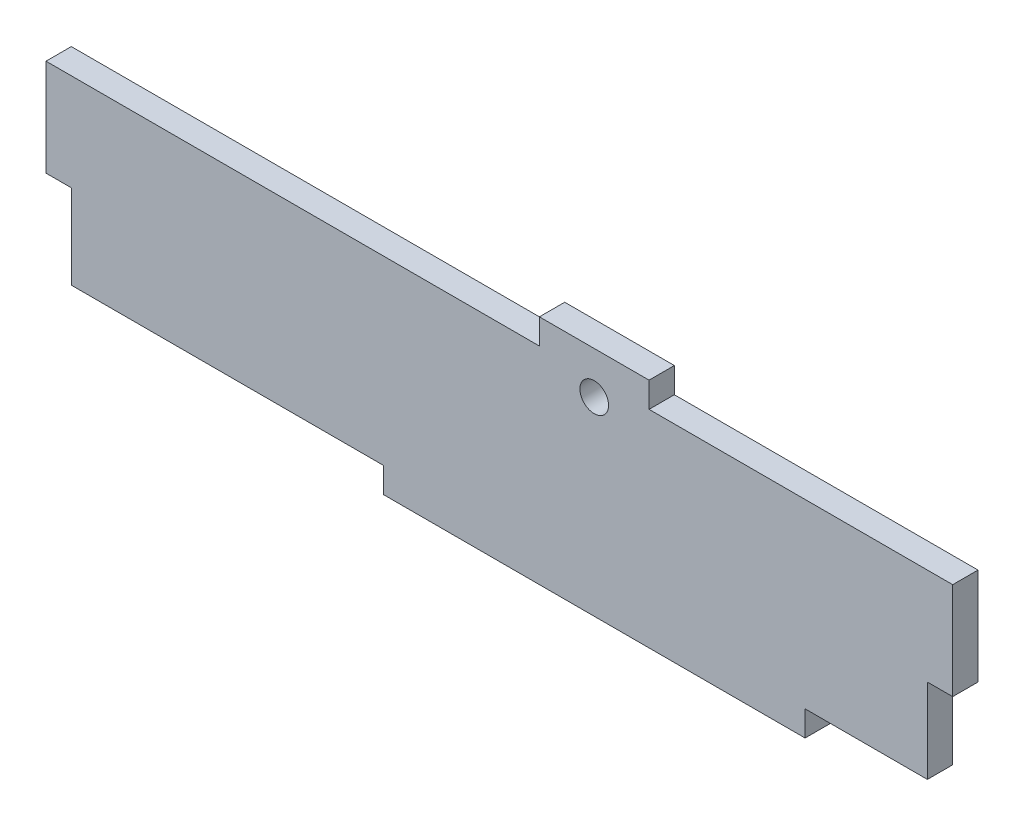
ISO-10303-21;
HEADER;
FILE_DESCRIPTION(('STEP AP214'),'2;1');
FILE_NAME('part.step','',(''),(''),'','','');
FILE_SCHEMA(('AUTOMOTIVE_DESIGN { 1 0 10303 214 1 1 1 1 }'));
ENDSEC;
DATA;
#1=APPLICATION_CONTEXT('core data for automotive mechanical design processes');
#2=APPLICATION_PROTOCOL_DEFINITION('international standard','automotive_design',2000,#1);
#3=PRODUCT_CONTEXT('',#1,'mechanical');
#4=PRODUCT('Part','Part','',(#3));
#5=PRODUCT_RELATED_PRODUCT_CATEGORY('part','',(#4));
#6=PRODUCT_DEFINITION_FORMATION('','',#4);
#7=PRODUCT_DEFINITION_CONTEXT('part definition',#1,'design');
#8=PRODUCT_DEFINITION('design','',#6,#7);
#9=PRODUCT_DEFINITION_SHAPE('','',#8);
#10=(LENGTH_UNIT() NAMED_UNIT(*) SI_UNIT(.MILLI.,.METRE.));
#11=(NAMED_UNIT(*) PLANE_ANGLE_UNIT() SI_UNIT($,.RADIAN.));
#12=(NAMED_UNIT(*) SI_UNIT($,.STERADIAN.) SOLID_ANGLE_UNIT());
#13=UNCERTAINTY_MEASURE_WITH_UNIT(LENGTH_MEASURE(1.E-05),#10,'distance_accuracy_value','');
#14=(GEOMETRIC_REPRESENTATION_CONTEXT(3) GLOBAL_UNCERTAINTY_ASSIGNED_CONTEXT((#13)) GLOBAL_UNIT_ASSIGNED_CONTEXT((#10,
#11,#12)) REPRESENTATION_CONTEXT('',''));
#15=CARTESIAN_POINT('',(0.,0.,0.));
#16=DIRECTION('',(0.,0.,1.));
#17=DIRECTION('',(1.,0.,0.));
#18=AXIS2_PLACEMENT_3D('',#15,#16,#17);
#19=CARTESIAN_POINT('',(-130.,0.,6.));
#20=DIRECTION('',(0.,1.,0.));
#21=DIRECTION('',(0.,0.,1.));
#22=AXIS2_PLACEMENT_3D('',#19,#20,#21);
#23=PLANE('',#22);
#24=DIRECTION('',(0.,0.,-1.));
#25=VECTOR('',#24,1.);
#26=CARTESIAN_POINT('',(-50.,0.,6.));
#27=LINE('',#26,#25);
#28=CARTESIAN_POINT('',(-50.,0.,6.));
#29=VERTEX_POINT('',#28);
#30=CARTESIAN_POINT('',(-50.,0.,0.));
#31=VERTEX_POINT('',#30);
#32=EDGE_CURVE('E180',#29,#31,#27,.T.);
#33=ORIENTED_EDGE('',*,*,#32,.F.);
#34=DIRECTION('',(1.,0.,0.));
#35=VECTOR('',#34,1.);
#36=CARTESIAN_POINT('',(-130.,0.,6.));
#37=LINE('',#36,#35);
#38=CARTESIAN_POINT('',(-124.,0.,6.));
#39=VERTEX_POINT('',#38);
#40=EDGE_CURVE('E263',#39,#29,#37,.T.);
#41=ORIENTED_EDGE('',*,*,#40,.F.);
#42=DIRECTION('',(0.,0.,-1.));
#43=VECTOR('',#42,1.);
#44=CARTESIAN_POINT('',(-124.,0.,6.001));
#45=LINE('',#44,#43);
#46=CARTESIAN_POINT('',(-124.,0.,0.));
#47=VERTEX_POINT('',#46);
#48=EDGE_CURVE('E210',#39,#47,#45,.T.);
#49=ORIENTED_EDGE('',*,*,#48,.T.);
#50=DIRECTION('',(1.,0.,0.));
#51=VECTOR('',#50,1.);
#52=CARTESIAN_POINT('',(-130.,0.,0.));
#53=LINE('',#52,#51);
#54=EDGE_CURVE('E269',#47,#31,#53,.T.);
#55=ORIENTED_EDGE('',*,*,#54,.T.);
#56=EDGE_LOOP('',(#33,#41,#49,#55));
#57=FACE_BOUND('',#56,.T.);
#58=ADVANCED_FACE('F33',(#57),#23,.F.);
#59=CARTESIAN_POINT('',(-130.,0.,6.));
#60=DIRECTION('',(1.,0.,0.));
#61=DIRECTION('',(0.,0.,-1.));
#62=AXIS2_PLACEMENT_3D('',#59,#60,#61);
#63=PLANE('',#62);
#64=DIRECTION('',(0.,-1.,0.));
#65=VECTOR('',#64,1.);
#66=CARTESIAN_POINT('',(-130.,0.,0.));
#67=LINE('',#66,#65);
#68=CARTESIAN_POINT('',(-130.,43.,0.));
#69=VERTEX_POINT('',#68);
#70=CARTESIAN_POINT('',(-130.,20.,0.));
#71=VERTEX_POINT('',#70);
#72=EDGE_CURVE('E243',#69,#71,#67,.T.);
#73=ORIENTED_EDGE('',*,*,#72,.T.);
#74=DIRECTION('',(0.,0.,-1.));
#75=VECTOR('',#74,1.);
#76=CARTESIAN_POINT('',(-130.,20.,6.001));
#77=LINE('',#76,#75);
#78=CARTESIAN_POINT('',(-130.,20.,6.));
#79=VERTEX_POINT('',#78);
#80=EDGE_CURVE('E58',#79,#71,#77,.T.);
#81=ORIENTED_EDGE('',*,*,#80,.F.);
#82=DIRECTION('',(0.,-1.,0.));
#83=VECTOR('',#82,1.);
#84=CARTESIAN_POINT('',(-130.,0.,6.));
#85=LINE('',#84,#83);
#86=CARTESIAN_POINT('',(-130.,43.,6.));
#87=VERTEX_POINT('',#86);
#88=EDGE_CURVE('E259',#87,#79,#85,.T.);
#89=ORIENTED_EDGE('',*,*,#88,.F.);
#90=DIRECTION('',(0.,0.,-1.));
#91=VECTOR('',#90,1.);
#92=CARTESIAN_POINT('',(-130.,43.,6.001));
#93=LINE('',#92,#91);
#94=EDGE_CURVE('E252',#87,#69,#93,.T.);
#95=ORIENTED_EDGE('',*,*,#94,.T.);
#96=EDGE_LOOP('',(#73,#81,#89,#95));
#97=FACE_BOUND('',#96,.T.);
#98=ADVANCED_FACE('F35',(#97),#63,.F.);
#99=CARTESIAN_POINT('',(50.,0.,6.));
#100=VERTEX_POINT('',#99);
#101=CARTESIAN_POINT('',(79.,0.,6.));
#102=VERTEX_POINT('',#101);
#103=EDGE_CURVE('E262',#100,#102,#37,.T.);
#104=ORIENTED_EDGE('',*,*,#103,.F.);
#105=DIRECTION('',(0.,0.,-1.));
#106=VECTOR('',#105,1.);
#107=CARTESIAN_POINT('',(50.,0.,6.));
#108=LINE('',#107,#106);
#109=CARTESIAN_POINT('',(50.,0.,0.));
#110=VERTEX_POINT('',#109);
#111=EDGE_CURVE('E169',#100,#110,#108,.T.);
#112=ORIENTED_EDGE('',*,*,#111,.T.);
#113=CARTESIAN_POINT('',(79.,0.,0.));
#114=VERTEX_POINT('',#113);
#115=EDGE_CURVE('E268',#110,#114,#53,.T.);
#116=ORIENTED_EDGE('',*,*,#115,.T.);
#117=DIRECTION('',(0.,0.,-1.));
#118=VECTOR('',#117,1.);
#119=CARTESIAN_POINT('',(79.,0.,6.001));
#120=LINE('',#119,#118);
#121=EDGE_CURVE('E195',#102,#114,#120,.T.);
#122=ORIENTED_EDGE('',*,*,#121,.F.);
#123=EDGE_LOOP('',(#104,#112,#116,#122));
#124=FACE_BOUND('',#123,.T.);
#125=ADVANCED_FACE('F314',(#124),#23,.F.);
#126=CARTESIAN_POINT('',(85.,0.,6.));
#127=DIRECTION('',(-1.,0.,0.));
#128=DIRECTION('',(0.,0.,1.));
#129=AXIS2_PLACEMENT_3D('',#126,#127,#128);
#130=PLANE('',#129);
#131=DIRECTION('',(0.,1.,0.));
#132=VECTOR('',#131,1.);
#133=CARTESIAN_POINT('',(85.,0.,6.));
#134=LINE('',#133,#132);
#135=CARTESIAN_POINT('',(85.,20.,6.));
#136=VERTEX_POINT('',#135);
#137=CARTESIAN_POINT('',(85.,43.,6.));
#138=VERTEX_POINT('',#137);
#139=EDGE_CURVE('E42',#136,#138,#134,.T.);
#140=ORIENTED_EDGE('',*,*,#139,.F.);
#141=DIRECTION('',(0.,0.,-1.));
#142=VECTOR('',#141,1.);
#143=CARTESIAN_POINT('',(85.,20.,6.001));
#144=LINE('',#143,#142);
#145=CARTESIAN_POINT('',(85.,20.,0.));
#146=VERTEX_POINT('',#145);
#147=EDGE_CURVE('E196',#136,#146,#144,.T.);
#148=ORIENTED_EDGE('',*,*,#147,.T.);
#149=DIRECTION('',(0.,1.,0.));
#150=VECTOR('',#149,1.);
#151=CARTESIAN_POINT('',(85.,0.,0.));
#152=LINE('',#151,#150);
#153=CARTESIAN_POINT('',(85.,43.,0.));
#154=VERTEX_POINT('',#153);
#155=EDGE_CURVE('E271',#146,#154,#152,.T.);
#156=ORIENTED_EDGE('',*,*,#155,.T.);
#157=DIRECTION('',(0.,0.,-1.));
#158=VECTOR('',#157,1.);
#159=CARTESIAN_POINT('',(85.,43.,6.001));
#160=LINE('',#159,#158);
#161=EDGE_CURVE('E232',#138,#154,#160,.T.);
#162=ORIENTED_EDGE('',*,*,#161,.F.);
#163=EDGE_LOOP('',(#140,#148,#156,#162));
#164=FACE_BOUND('',#163,.T.);
#165=ADVANCED_FACE('F309',(#164),#130,.F.);
#166=CARTESIAN_POINT('',(-130.,48.9999999999999,6.));
#167=DIRECTION('',(0.,-1.,0.));
#168=DIRECTION('',(0.,0.,-1.));
#169=AXIS2_PLACEMENT_3D('',#166,#167,#168);
#170=PLANE('',#169);
#171=DIRECTION('',(-1.,0.,0.));
#172=VECTOR('',#171,1.);
#173=CARTESIAN_POINT('',(-130.,48.9999999999999,6.));
#174=LINE('',#173,#172);
#175=CARTESIAN_POINT('',(13.,48.9999999999999,6.));
#176=VERTEX_POINT('',#175);
#177=CARTESIAN_POINT('',(-13.,48.9999999999999,6.));
#178=VERTEX_POINT('',#177);
#179=EDGE_CURVE('E11',#176,#178,#174,.T.);
#180=ORIENTED_EDGE('',*,*,#179,.F.);
#181=DIRECTION('',(0.,0.,-1.));
#182=VECTOR('',#181,1.);
#183=CARTESIAN_POINT('',(13.,48.9999999999999,6.001));
#184=LINE('',#183,#182);
#185=CARTESIAN_POINT('',(13.,48.9999999999999,0.));
#186=VERTEX_POINT('',#185);
#187=EDGE_CURVE('E233',#176,#186,#184,.T.);
#188=ORIENTED_EDGE('',*,*,#187,.T.);
#189=DIRECTION('',(-1.,0.,0.));
#190=VECTOR('',#189,1.);
#191=CARTESIAN_POINT('',(-130.,48.9999999999999,0.));
#192=LINE('',#191,#190);
#193=CARTESIAN_POINT('',(-13.,48.9999999999999,0.));
#194=VERTEX_POINT('',#193);
#195=EDGE_CURVE('E37',#186,#194,#192,.T.);
#196=ORIENTED_EDGE('',*,*,#195,.T.);
#197=DIRECTION('',(0.,0.,-1.));
#198=VECTOR('',#197,1.);
#199=CARTESIAN_POINT('',(-13.,48.9999999999999,6.001));
#200=LINE('',#199,#198);
#201=EDGE_CURVE('E250',#178,#194,#200,.T.);
#202=ORIENTED_EDGE('',*,*,#201,.F.);
#203=EDGE_LOOP('',(#180,#188,#196,#202));
#204=FACE_BOUND('',#203,.T.);
#205=ADVANCED_FACE('F280',(#204),#170,.F.);
#206=CARTESIAN_POINT('',(0.,0.,6.));
#207=DIRECTION('',(0.,0.,-1.));
#208=DIRECTION('',(-1.,0.,0.));
#209=AXIS2_PLACEMENT_3D('',#206,#207,#208);
#210=PLANE('',#209);
#211=CARTESIAN_POINT('',(0.,39.,6.));
#212=DIRECTION('',(0.,0.,-1.));
#213=DIRECTION('',(-1.,0.,0.));
#214=AXIS2_PLACEMENT_3D('',#211,#212,#213);
#215=CIRCLE('',#214,3.4);
#216=CARTESIAN_POINT('',(-3.39999999999999,39.,6.));
#217=VERTEX_POINT('',#216);
#218=EDGE_CURVE('E219',#217,#217,#215,.T.);
#219=ORIENTED_EDGE('',*,*,#218,.T.);
#220=EDGE_LOOP('',(#219));
#221=FACE_BOUND('',#220,.T.);
#222=DIRECTION('',(0.,-1.,0.));
#223=VECTOR('',#222,1.);
#224=CARTESIAN_POINT('',(79.,0.,6.));
#225=LINE('',#224,#223);
#226=CARTESIAN_POINT('',(79.,20.,6.));
#227=VERTEX_POINT('',#226);
#228=EDGE_CURVE('E183',#227,#102,#225,.T.);
#229=ORIENTED_EDGE('',*,*,#228,.F.);
#230=DIRECTION('',(-1.,0.,0.));
#231=VECTOR('',#230,1.);
#232=CARTESIAN_POINT('',(85.,20.,6.));
#233=LINE('',#232,#231);
#234=EDGE_CURVE('E186',#136,#227,#233,.T.);
#235=ORIENTED_EDGE('',*,*,#234,.F.);
#236=ORIENTED_EDGE('',*,*,#139,.T.);
#237=DIRECTION('',(1.,0.,0.));
#238=VECTOR('',#237,1.);
#239=CARTESIAN_POINT('',(85.,43.,6.));
#240=LINE('',#239,#238);
#241=CARTESIAN_POINT('',(13.,43.,6.));
#242=VERTEX_POINT('',#241);
#243=EDGE_CURVE('E236',#242,#138,#240,.T.);
#244=ORIENTED_EDGE('',*,*,#243,.F.);
#245=DIRECTION('',(0.,-1.,0.));
#246=VECTOR('',#245,1.);
#247=CARTESIAN_POINT('',(13.,48.9999999999999,6.));
#248=LINE('',#247,#246);
#249=EDGE_CURVE('E223',#176,#242,#248,.T.);
#250=ORIENTED_EDGE('',*,*,#249,.F.);
#251=ORIENTED_EDGE('',*,*,#179,.T.);
#252=DIRECTION('',(0.,1.,0.));
#253=VECTOR('',#252,1.);
#254=CARTESIAN_POINT('',(-13.,48.9999999999999,6.));
#255=LINE('',#254,#253);
#256=CARTESIAN_POINT('',(-13.,43.,6.));
#257=VERTEX_POINT('',#256);
#258=EDGE_CURVE('E222',#257,#178,#255,.T.);
#259=ORIENTED_EDGE('',*,*,#258,.F.);
#260=DIRECTION('',(1.,0.,0.));
#261=VECTOR('',#260,1.);
#262=CARTESIAN_POINT('',(-13.,43.,6.));
#263=LINE('',#262,#261);
#264=EDGE_CURVE('E227',#87,#257,#263,.T.);
#265=ORIENTED_EDGE('',*,*,#264,.F.);
#266=ORIENTED_EDGE('',*,*,#88,.T.);
#267=DIRECTION('',(-1.,0.,0.));
#268=VECTOR('',#267,1.);
#269=CARTESIAN_POINT('',(-130.,20.,6.));
#270=LINE('',#269,#268);
#271=CARTESIAN_POINT('',(-124.,20.,6.));
#272=VERTEX_POINT('',#271);
#273=EDGE_CURVE('E187',#272,#79,#270,.T.);
#274=ORIENTED_EDGE('',*,*,#273,.F.);
#275=DIRECTION('',(0.,1.,0.));
#276=VECTOR('',#275,1.);
#277=CARTESIAN_POINT('',(-124.,0.,6.));
#278=LINE('',#277,#276);
#279=EDGE_CURVE('E179',#39,#272,#278,.T.);
#280=ORIENTED_EDGE('',*,*,#279,.F.);
#281=ORIENTED_EDGE('',*,*,#40,.T.);
#282=DIRECTION('',(0.,1.,0.));
#283=VECTOR('',#282,1.);
#284=CARTESIAN_POINT('',(-50.,0.,6.));
#285=LINE('',#284,#283);
#286=CARTESIAN_POINT('',(-50.,-5.99999999999998,6.));
#287=VERTEX_POINT('',#286);
#288=EDGE_CURVE('E157',#287,#29,#285,.T.);
#289=ORIENTED_EDGE('',*,*,#288,.F.);
#290=DIRECTION('',(-1.,0.,0.));
#291=VECTOR('',#290,1.);
#292=CARTESIAN_POINT('',(50.,-6.,6.));
#293=LINE('',#292,#291);
#294=CARTESIAN_POINT('',(50.,-6.,6.));
#295=VERTEX_POINT('',#294);
#296=EDGE_CURVE('E152',#295,#287,#293,.T.);
#297=ORIENTED_EDGE('',*,*,#296,.F.);
#298=DIRECTION('',(0.,-1.,0.));
#299=VECTOR('',#298,1.);
#300=CARTESIAN_POINT('',(50.,0.,6.));
#301=LINE('',#300,#299);
#302=EDGE_CURVE('E164',#100,#295,#301,.T.);
#303=ORIENTED_EDGE('',*,*,#302,.F.);
#304=ORIENTED_EDGE('',*,*,#103,.T.);
#305=EDGE_LOOP('',(#229,#235,#236,#244,#250,#251,#259,#265,#266,#274,#280,#281,#289,#297,#303,#304));
#306=FACE_BOUND('',#305,.T.);
#307=ADVANCED_FACE('F163',(#221,#306),#210,.F.);
#308=CARTESIAN_POINT('',(0.,0.,0.));
#309=DIRECTION('',(0.,0.,-1.));
#310=DIRECTION('',(-1.,0.,0.));
#311=AXIS2_PLACEMENT_3D('',#308,#309,#310);
#312=PLANE('',#311);
#313=DIRECTION('',(1.,0.,0.));
#314=VECTOR('',#313,1.);
#315=CARTESIAN_POINT('',(85.,20.,0.));
#316=LINE('',#315,#314);
#317=CARTESIAN_POINT('',(79.,20.,0.));
#318=VERTEX_POINT('',#317);
#319=EDGE_CURVE('E193',#318,#146,#316,.T.);
#320=ORIENTED_EDGE('',*,*,#319,.F.);
#321=DIRECTION('',(0.,1.,0.));
#322=VECTOR('',#321,1.);
#323=CARTESIAN_POINT('',(79.,0.,0.));
#324=LINE('',#323,#322);
#325=EDGE_CURVE('E190',#114,#318,#324,.T.);
#326=ORIENTED_EDGE('',*,*,#325,.F.);
#327=ORIENTED_EDGE('',*,*,#115,.F.);
#328=DIRECTION('',(0.,-1.,0.));
#329=VECTOR('',#328,1.);
#330=CARTESIAN_POINT('',(50.,0.,0.));
#331=LINE('',#330,#329);
#332=CARTESIAN_POINT('',(50.,-6.,0.));
#333=VERTEX_POINT('',#332);
#334=EDGE_CURVE('E50',#110,#333,#331,.T.);
#335=ORIENTED_EDGE('',*,*,#334,.T.);
#336=DIRECTION('',(-1.,0.,0.));
#337=VECTOR('',#336,1.);
#338=CARTESIAN_POINT('',(50.,-6.,0.));
#339=LINE('',#338,#337);
#340=CARTESIAN_POINT('',(-50.,-5.99999999999998,0.));
#341=VERTEX_POINT('',#340);
#342=EDGE_CURVE('E154',#333,#341,#339,.T.);
#343=ORIENTED_EDGE('',*,*,#342,.T.);
#344=DIRECTION('',(0.,1.,0.));
#345=VECTOR('',#344,1.);
#346=CARTESIAN_POINT('',(-50.,0.,0.));
#347=LINE('',#346,#345);
#348=EDGE_CURVE('E170',#341,#31,#347,.T.);
#349=ORIENTED_EDGE('',*,*,#348,.T.);
#350=ORIENTED_EDGE('',*,*,#54,.F.);
#351=DIRECTION('',(0.,-1.,0.));
#352=VECTOR('',#351,1.);
#353=CARTESIAN_POINT('',(-124.,0.,0.));
#354=LINE('',#353,#352);
#355=CARTESIAN_POINT('',(-124.,20.,0.));
#356=VERTEX_POINT('',#355);
#357=EDGE_CURVE('E208',#356,#47,#354,.T.);
#358=ORIENTED_EDGE('',*,*,#357,.F.);
#359=DIRECTION('',(1.,0.,0.));
#360=VECTOR('',#359,1.);
#361=CARTESIAN_POINT('',(-130.,20.,0.));
#362=LINE('',#361,#360);
#363=EDGE_CURVE('E206',#71,#356,#362,.T.);
#364=ORIENTED_EDGE('',*,*,#363,.F.);
#365=ORIENTED_EDGE('',*,*,#72,.F.);
#366=DIRECTION('',(-1.,0.,0.));
#367=VECTOR('',#366,1.);
#368=CARTESIAN_POINT('',(-13.,43.,0.));
#369=LINE('',#368,#367);
#370=CARTESIAN_POINT('',(-13.,43.,0.));
#371=VERTEX_POINT('',#370);
#372=EDGE_CURVE('E247',#371,#69,#369,.T.);
#373=ORIENTED_EDGE('',*,*,#372,.F.);
#374=DIRECTION('',(0.,-1.,0.));
#375=VECTOR('',#374,1.);
#376=CARTESIAN_POINT('',(-13.,48.9999999999999,0.));
#377=LINE('',#376,#375);
#378=EDGE_CURVE('E245',#194,#371,#377,.T.);
#379=ORIENTED_EDGE('',*,*,#378,.F.);
#380=ORIENTED_EDGE('',*,*,#195,.F.);
#381=DIRECTION('',(0.,1.,0.));
#382=VECTOR('',#381,1.);
#383=CARTESIAN_POINT('',(13.,48.9999999999999,0.));
#384=LINE('',#383,#382);
#385=CARTESIAN_POINT('',(13.,43.,0.));
#386=VERTEX_POINT('',#385);
#387=EDGE_CURVE('E230',#386,#186,#384,.T.);
#388=ORIENTED_EDGE('',*,*,#387,.F.);
#389=DIRECTION('',(-1.,0.,0.));
#390=VECTOR('',#389,1.);
#391=CARTESIAN_POINT('',(85.,43.,0.));
#392=LINE('',#391,#390);
#393=EDGE_CURVE('E226',#154,#386,#392,.T.);
#394=ORIENTED_EDGE('',*,*,#393,.F.);
#395=ORIENTED_EDGE('',*,*,#155,.F.);
#396=EDGE_LOOP('',(#320,#326,#327,#335,#343,#349,#350,#358,#364,#365,#373,#379,#380,#388,#394,#395));
#397=FACE_BOUND('',#396,.T.);
#398=CARTESIAN_POINT('',(0.,39.,0.));
#399=DIRECTION('',(0.,0.,-1.));
#400=DIRECTION('',(-1.,0.,0.));
#401=AXIS2_PLACEMENT_3D('',#398,#399,#400);
#402=CIRCLE('',#401,3.39999999999999);
#403=CARTESIAN_POINT('',(-3.39999999999999,39.,0.));
#404=VERTEX_POINT('',#403);
#405=EDGE_CURVE('E199',#404,#404,#402,.T.);
#406=ORIENTED_EDGE('',*,*,#405,.F.);
#407=EDGE_LOOP('',(#406));
#408=FACE_BOUND('',#407,.T.);
#409=ADVANCED_FACE('F285',(#397,#408),#312,.T.);
#410=CARTESIAN_POINT('',(-13.,48.9999999999999,6.001));
#411=DIRECTION('',(1.,0.,0.));
#412=DIRECTION('',(0.,0.,-1.));
#413=AXIS2_PLACEMENT_3D('',#410,#411,#412);
#414=PLANE('',#413);
#415=ORIENTED_EDGE('',*,*,#258,.T.);
#416=ORIENTED_EDGE('',*,*,#201,.T.);
#417=ORIENTED_EDGE('',*,*,#378,.T.);
#418=DIRECTION('',(0.,0.,-1.));
#419=VECTOR('',#418,1.);
#420=CARTESIAN_POINT('',(-13.,43.,6.001));
#421=LINE('',#420,#419);
#422=EDGE_CURVE('E249',#257,#371,#421,.T.);
#423=ORIENTED_EDGE('',*,*,#422,.F.);
#424=EDGE_LOOP('',(#415,#416,#417,#423));
#425=FACE_BOUND('',#424,.T.);
#426=ADVANCED_FACE('F291',(#425),#414,.F.);
#427=CARTESIAN_POINT('',(-13.,43.,6.001));
#428=DIRECTION('',(0.,-1.,0.));
#429=DIRECTION('',(0.,0.,-1.));
#430=AXIS2_PLACEMENT_3D('',#427,#428,#429);
#431=PLANE('',#430);
#432=ORIENTED_EDGE('',*,*,#264,.T.);
#433=ORIENTED_EDGE('',*,*,#422,.T.);
#434=ORIENTED_EDGE('',*,*,#372,.T.);
#435=ORIENTED_EDGE('',*,*,#94,.F.);
#436=EDGE_LOOP('',(#432,#433,#434,#435));
#437=FACE_BOUND('',#436,.T.);
#438=ADVANCED_FACE('F293',(#437),#431,.F.);
#439=CARTESIAN_POINT('',(13.,48.9999999999999,6.001));
#440=DIRECTION('',(-1.,0.,0.));
#441=DIRECTION('',(0.,0.,1.));
#442=AXIS2_PLACEMENT_3D('',#439,#440,#441);
#443=PLANE('',#442);
#444=ORIENTED_EDGE('',*,*,#249,.T.);
#445=DIRECTION('',(0.,0.,-1.));
#446=VECTOR('',#445,1.);
#447=CARTESIAN_POINT('',(13.,43.,6.001));
#448=LINE('',#447,#446);
#449=EDGE_CURVE('E237',#242,#386,#448,.T.);
#450=ORIENTED_EDGE('',*,*,#449,.T.);
#451=ORIENTED_EDGE('',*,*,#387,.T.);
#452=ORIENTED_EDGE('',*,*,#187,.F.);
#453=EDGE_LOOP('',(#444,#450,#451,#452));
#454=FACE_BOUND('',#453,.T.);
#455=ADVANCED_FACE('F300',(#454),#443,.F.);
#456=CARTESIAN_POINT('',(85.,43.,6.001));
#457=DIRECTION('',(0.,-1.,0.));
#458=DIRECTION('',(0.,0.,-1.));
#459=AXIS2_PLACEMENT_3D('',#456,#457,#458);
#460=PLANE('',#459);
#461=ORIENTED_EDGE('',*,*,#243,.T.);
#462=ORIENTED_EDGE('',*,*,#161,.T.);
#463=ORIENTED_EDGE('',*,*,#393,.T.);
#464=ORIENTED_EDGE('',*,*,#449,.F.);
#465=EDGE_LOOP('',(#461,#462,#463,#464));
#466=FACE_BOUND('',#465,.T.);
#467=ADVANCED_FACE('F302',(#466),#460,.F.);
#468=CARTESIAN_POINT('',(0.,39.,0.));
#469=DIRECTION('',(0.,0.,-1.));
#470=DIRECTION('',(-1.,0.,0.));
#471=AXIS2_PLACEMENT_3D('',#468,#469,#470);
#472=CYLINDRICAL_SURFACE('',#471,3.39999999999999);
#473=ORIENTED_EDGE('',*,*,#218,.F.);
#474=EDGE_LOOP('',(#473));
#475=FACE_BOUND('',#474,.T.);
#476=ORIENTED_EDGE('',*,*,#405,.T.);
#477=EDGE_LOOP('',(#476));
#478=FACE_BOUND('',#477,.T.);
#479=ADVANCED_FACE('F351',(#475,#478),#472,.F.);
#480=CARTESIAN_POINT('',(-124.,0.,6.001));
#481=DIRECTION('',(1.,0.,0.));
#482=DIRECTION('',(0.,0.,-1.));
#483=AXIS2_PLACEMENT_3D('',#480,#481,#482);
#484=PLANE('',#483);
#485=ORIENTED_EDGE('',*,*,#279,.T.);
#486=DIRECTION('',(0.,0.,-1.));
#487=VECTOR('',#486,1.);
#488=CARTESIAN_POINT('',(-124.,20.,6.001));
#489=LINE('',#488,#487);
#490=EDGE_CURVE('E213',#272,#356,#489,.T.);
#491=ORIENTED_EDGE('',*,*,#490,.T.);
#492=ORIENTED_EDGE('',*,*,#357,.T.);
#493=ORIENTED_EDGE('',*,*,#48,.F.);
#494=EDGE_LOOP('',(#485,#491,#492,#493));
#495=FACE_BOUND('',#494,.T.);
#496=ADVANCED_FACE('F324',(#495),#484,.F.);
#497=CARTESIAN_POINT('',(-130.,20.,6.001));
#498=DIRECTION('',(0.,1.,0.));
#499=DIRECTION('',(0.,0.,1.));
#500=AXIS2_PLACEMENT_3D('',#497,#498,#499);
#501=PLANE('',#500);
#502=ORIENTED_EDGE('',*,*,#273,.T.);
#503=ORIENTED_EDGE('',*,*,#80,.T.);
#504=ORIENTED_EDGE('',*,*,#363,.T.);
#505=ORIENTED_EDGE('',*,*,#490,.F.);
#506=EDGE_LOOP('',(#502,#503,#504,#505));
#507=FACE_BOUND('',#506,.T.);
#508=ADVANCED_FACE('F326',(#507),#501,.F.);
#509=CARTESIAN_POINT('',(85.,20.,6.001));
#510=DIRECTION('',(0.,1.,0.));
#511=DIRECTION('',(0.,0.,1.));
#512=AXIS2_PLACEMENT_3D('',#509,#510,#511);
#513=PLANE('',#512);
#514=ORIENTED_EDGE('',*,*,#234,.T.);
#515=DIRECTION('',(0.,0.,-1.));
#516=VECTOR('',#515,1.);
#517=CARTESIAN_POINT('',(79.,20.,6.001));
#518=LINE('',#517,#516);
#519=EDGE_CURVE('E200',#227,#318,#518,.T.);
#520=ORIENTED_EDGE('',*,*,#519,.T.);
#521=ORIENTED_EDGE('',*,*,#319,.T.);
#522=ORIENTED_EDGE('',*,*,#147,.F.);
#523=EDGE_LOOP('',(#514,#520,#521,#522));
#524=FACE_BOUND('',#523,.T.);
#525=ADVANCED_FACE('F306',(#524),#513,.F.);
#526=CARTESIAN_POINT('',(79.,0.,6.001));
#527=DIRECTION('',(-1.,0.,0.));
#528=DIRECTION('',(0.,0.,1.));
#529=AXIS2_PLACEMENT_3D('',#526,#527,#528);
#530=PLANE('',#529);
#531=ORIENTED_EDGE('',*,*,#228,.T.);
#532=ORIENTED_EDGE('',*,*,#121,.T.);
#533=ORIENTED_EDGE('',*,*,#325,.T.);
#534=ORIENTED_EDGE('',*,*,#519,.F.);
#535=EDGE_LOOP('',(#531,#532,#533,#534));
#536=FACE_BOUND('',#535,.T.);
#537=ADVANCED_FACE('F312',(#536),#530,.F.);
#538=CARTESIAN_POINT('',(50.,0.,6.));
#539=DIRECTION('',(1.,0.,0.));
#540=DIRECTION('',(0.,0.,-1.));
#541=AXIS2_PLACEMENT_3D('',#538,#539,#540);
#542=PLANE('',#541);
#543=ORIENTED_EDGE('',*,*,#334,.F.);
#544=ORIENTED_EDGE('',*,*,#111,.F.);
#545=ORIENTED_EDGE('',*,*,#302,.T.);
#546=DIRECTION('',(0.,0.,-1.));
#547=VECTOR('',#546,1.);
#548=CARTESIAN_POINT('',(50.,-6.,6.));
#549=LINE('',#548,#547);
#550=EDGE_CURVE('E149',#295,#333,#549,.T.);
#551=ORIENTED_EDGE('',*,*,#550,.T.);
#552=EDGE_LOOP('',(#543,#544,#545,#551));
#553=FACE_BOUND('',#552,.T.);
#554=ADVANCED_FACE('F168',(#553),#542,.T.);
#555=CARTESIAN_POINT('',(-50.,0.,6.));
#556=DIRECTION('',(-1.,0.,0.));
#557=DIRECTION('',(0.,0.,1.));
#558=AXIS2_PLACEMENT_3D('',#555,#556,#557);
#559=PLANE('',#558);
#560=ORIENTED_EDGE('',*,*,#348,.F.);
#561=DIRECTION('',(0.,0.,-1.));
#562=VECTOR('',#561,1.);
#563=CARTESIAN_POINT('',(-50.,-5.99999999999998,6.));
#564=LINE('',#563,#562);
#565=EDGE_CURVE('E156',#287,#341,#564,.T.);
#566=ORIENTED_EDGE('',*,*,#565,.F.);
#567=ORIENTED_EDGE('',*,*,#288,.T.);
#568=ORIENTED_EDGE('',*,*,#32,.T.);
#569=EDGE_LOOP('',(#560,#566,#567,#568));
#570=FACE_BOUND('',#569,.T.);
#571=ADVANCED_FACE('F367',(#570),#559,.T.);
#572=CARTESIAN_POINT('',(50.,-6.,6.));
#573=DIRECTION('',(0.,-1.,0.));
#574=DIRECTION('',(1.,0.,0.));
#575=AXIS2_PLACEMENT_3D('',#572,#573,#574);
#576=PLANE('',#575);
#577=ORIENTED_EDGE('',*,*,#342,.F.);
#578=ORIENTED_EDGE('',*,*,#550,.F.);
#579=ORIENTED_EDGE('',*,*,#296,.T.);
#580=ORIENTED_EDGE('',*,*,#565,.T.);
#581=EDGE_LOOP('',(#577,#578,#579,#580));
#582=FACE_BOUND('',#581,.T.);
#583=ADVANCED_FACE('F151',(#582),#576,.T.);
#584=CLOSED_SHELL('',(#58,#98,#125,#165,#205,#307,#409,#426,#438,#455,#467,#479,#496,#508,#525,
#537,#554,#571,#583));
#585=MANIFOLD_SOLID_BREP('B2',#584);
#586=ADVANCED_BREP_SHAPE_REPRESENTATION('',(#18,#585),#14);
#587=SHAPE_DEFINITION_REPRESENTATION(#9,#586);
ENDSEC;
END-ISO-10303-21;
